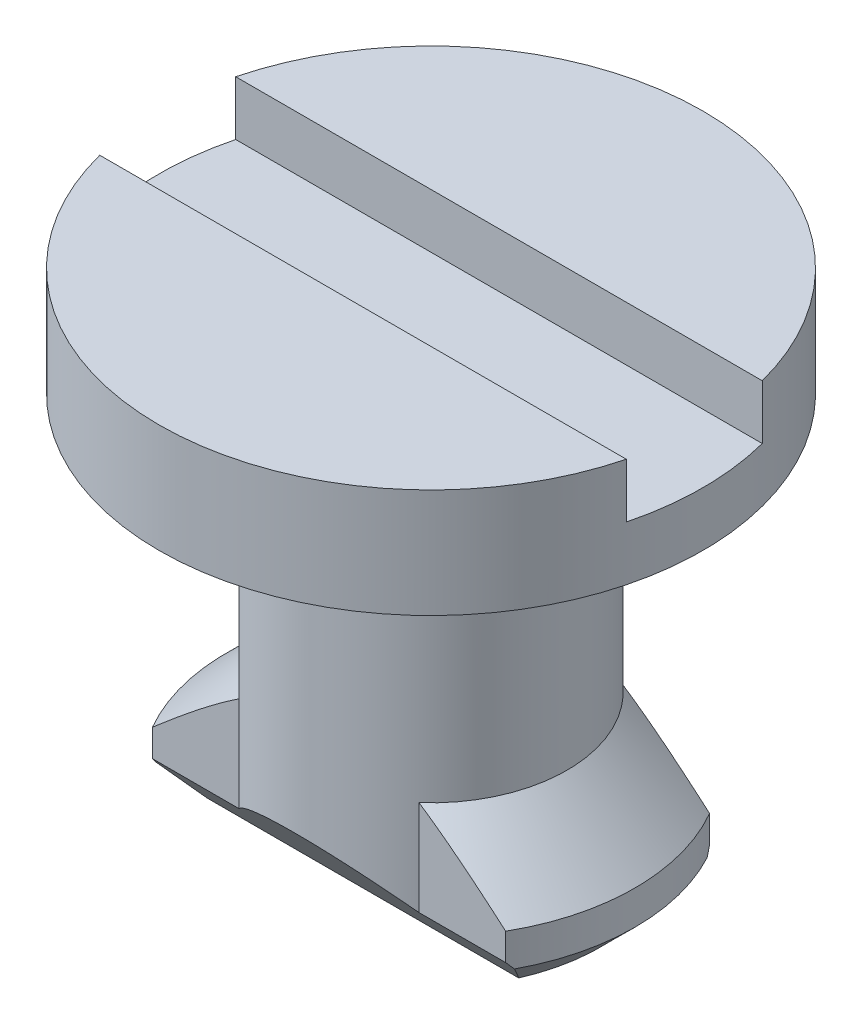
ISO-10303-21;
HEADER;
FILE_DESCRIPTION(('STEP AP214'),'2;1');
FILE_NAME('part.step','',(''),(''),'','','');
FILE_SCHEMA(('AUTOMOTIVE_DESIGN { 1 0 10303 214 1 1 1 1 }'));
ENDSEC;
DATA;
#1=APPLICATION_CONTEXT('core data for automotive mechanical design processes');
#2=APPLICATION_PROTOCOL_DEFINITION('international standard','automotive_design',2000,#1);
#3=PRODUCT_CONTEXT('',#1,'mechanical');
#4=PRODUCT('Part','Part','',(#3));
#5=PRODUCT_RELATED_PRODUCT_CATEGORY('part','',(#4));
#6=PRODUCT_DEFINITION_FORMATION('','',#4);
#7=PRODUCT_DEFINITION_CONTEXT('part definition',#1,'design');
#8=PRODUCT_DEFINITION('design','',#6,#7);
#9=PRODUCT_DEFINITION_SHAPE('','',#8);
#10=(LENGTH_UNIT() NAMED_UNIT(*) SI_UNIT(.MILLI.,.METRE.));
#11=(NAMED_UNIT(*) PLANE_ANGLE_UNIT() SI_UNIT($,.RADIAN.));
#12=(NAMED_UNIT(*) SI_UNIT($,.STERADIAN.) SOLID_ANGLE_UNIT());
#13=UNCERTAINTY_MEASURE_WITH_UNIT(LENGTH_MEASURE(1.E-05),#10,'distance_accuracy_value','');
#14=(GEOMETRIC_REPRESENTATION_CONTEXT(3) GLOBAL_UNCERTAINTY_ASSIGNED_CONTEXT((#13)) GLOBAL_UNIT_ASSIGNED_CONTEXT((#10,
#11,#12)) REPRESENTATION_CONTEXT('',''));
#15=CARTESIAN_POINT('',(0.,0.,0.));
#16=DIRECTION('',(0.,0.,1.));
#17=DIRECTION('',(1.,0.,0.));
#18=AXIS2_PLACEMENT_3D('',#15,#16,#17);
#19=CARTESIAN_POINT('',(0.,1.,0.));
#20=DIRECTION('',(0.,1.,0.));
#21=DIRECTION('',(0.,0.,1.));
#22=AXIS2_PLACEMENT_3D('',#19,#20,#21);
#23=PLANE('',#22);
#24=DIRECTION('',(-1.,0.,0.));
#25=VECTOR('',#24,1.);
#26=CARTESIAN_POINT('',(4.,1.,-1.));
#27=LINE('',#26,#25);
#28=CARTESIAN_POINT('',(3.87298334620742,1.,-1.));
#29=VERTEX_POINT('',#28);
#30=CARTESIAN_POINT('',(-3.87298334620742,1.,-1.));
#31=VERTEX_POINT('',#30);
#32=EDGE_CURVE('E165',#29,#31,#27,.T.);
#33=ORIENTED_EDGE('',*,*,#32,.F.);
#34=CARTESIAN_POINT('',(0.,1.,0.));
#35=DIRECTION('',(0.,1.,0.));
#36=DIRECTION('',(0.,0.,1.));
#37=AXIS2_PLACEMENT_3D('',#34,#35,#36);
#38=CIRCLE('',#37,4.);
#39=EDGE_CURVE('E171',#29,#31,#38,.T.);
#40=ORIENTED_EDGE('',*,*,#39,.T.);
#41=EDGE_LOOP('',(#33,#40));
#42=FACE_BOUND('',#41,.T.);
#43=ADVANCED_FACE('F34',(#42),#23,.T.);
#44=CARTESIAN_POINT('',(0.,-6.4,0.));
#45=DIRECTION('',(0.,1.,0.));
#46=DIRECTION('',(0.,0.,1.));
#47=AXIS2_PLACEMENT_3D('',#44,#45,#46);
#48=CYLINDRICAL_SURFACE('',#47,2.);
#49=CARTESIAN_POINT('',(0.,-0.6,0.));
#50=DIRECTION('',(0.,-1.,0.));
#51=DIRECTION('',(0.,0.,-1.));
#52=AXIS2_PLACEMENT_3D('',#49,#50,#51);
#53=CIRCLE('',#52,2.);
#54=CARTESIAN_POINT('',(0.,-0.6,-2.));
#55=VERTEX_POINT('',#54);
#56=EDGE_CURVE('E265',#55,#55,#53,.T.);
#57=ORIENTED_EDGE('',*,*,#56,.T.);
#58=EDGE_LOOP('',(#57));
#59=FACE_BOUND('',#58,.T.);
#60=CARTESIAN_POINT('',(0.,-7.6,0.));
#61=DIRECTION('',(0.,-0.640184399664479,-0.768221279597376));
#62=DIRECTION('',(0.,0.768221279597376,-0.640184399664479));
#63=AXIS2_PLACEMENT_3D('',#60,#61,#62);
#64=ELLIPSE('',#63,3.12409987036266,2.);
#65=CARTESIAN_POINT('',(1.32287565553229,-5.8,-1.5));
#66=VERTEX_POINT('',#65);
#67=CARTESIAN_POINT('',(-1.32287565553229,-5.8,-1.5));
#68=VERTEX_POINT('',#67);
#69=EDGE_CURVE('E58',#66,#68,#64,.F.);
#70=ORIENTED_EDGE('',*,*,#69,.T.);
#71=DIRECTION('',(0.,1.,0.));
#72=VECTOR('',#71,1.);
#73=CARTESIAN_POINT('',(-1.32287565553229,-6.4,-1.5));
#74=LINE('',#73,#72);
#75=CARTESIAN_POINT('',(-1.32287565553229,-4.4,-1.5));
#76=VERTEX_POINT('',#75);
#77=EDGE_CURVE('E513',#68,#76,#74,.T.);
#78=ORIENTED_EDGE('',*,*,#77,.T.);
#79=CARTESIAN_POINT('',(0.,-4.4,0.));
#80=DIRECTION('',(0.,-1.,0.));
#81=DIRECTION('',(0.,0.,-1.));
#82=AXIS2_PLACEMENT_3D('',#79,#80,#81);
#83=CIRCLE('',#82,2.);
#84=CARTESIAN_POINT('',(-1.3228756555323,-4.4,1.5));
#85=VERTEX_POINT('',#84);
#86=EDGE_CURVE('E175',#85,#76,#83,.T.);
#87=ORIENTED_EDGE('',*,*,#86,.F.);
#88=DIRECTION('',(0.,1.,0.));
#89=VECTOR('',#88,1.);
#90=CARTESIAN_POINT('',(-1.3228756555323,-6.4,1.5));
#91=LINE('',#90,#89);
#92=CARTESIAN_POINT('',(-1.3228756555323,-5.8,1.5));
#93=VERTEX_POINT('',#92);
#94=EDGE_CURVE('E176',#85,#93,#91,.F.);
#95=ORIENTED_EDGE('',*,*,#94,.T.);
#96=CARTESIAN_POINT('',(0.,-7.6,0.));
#97=DIRECTION('',(0.,-0.640184399664479,0.768221279597376));
#98=DIRECTION('',(0.,0.768221279597376,0.640184399664479));
#99=AXIS2_PLACEMENT_3D('',#96,#97,#98);
#100=ELLIPSE('',#99,3.12409987036266,2.);
#101=CARTESIAN_POINT('',(1.3228756555323,-5.8,1.5));
#102=VERTEX_POINT('',#101);
#103=EDGE_CURVE('E491',#93,#102,#100,.F.);
#104=ORIENTED_EDGE('',*,*,#103,.T.);
#105=DIRECTION('',(0.,1.,0.));
#106=VECTOR('',#105,1.);
#107=CARTESIAN_POINT('',(1.3228756555323,-6.4,1.5));
#108=LINE('',#107,#106);
#109=CARTESIAN_POINT('',(1.3228756555323,-4.4,1.5));
#110=VERTEX_POINT('',#109);
#111=EDGE_CURVE('E172',#102,#110,#108,.T.);
#112=ORIENTED_EDGE('',*,*,#111,.T.);
#113=CARTESIAN_POINT('',(1.32287565553229,-4.4,-1.5));
#114=VERTEX_POINT('',#113);
#115=EDGE_CURVE('E182',#114,#110,#83,.T.);
#116=ORIENTED_EDGE('',*,*,#115,.F.);
#117=DIRECTION('',(0.,1.,0.));
#118=VECTOR('',#117,1.);
#119=CARTESIAN_POINT('',(1.32287565553229,-6.4,-1.5));
#120=LINE('',#119,#118);
#121=EDGE_CURVE('E502',#114,#66,#120,.F.);
#122=ORIENTED_EDGE('',*,*,#121,.T.);
#123=EDGE_LOOP('',(#70,#78,#87,#95,#104,#112,#116,#122));
#124=FACE_BOUND('',#123,.T.);
#125=ADVANCED_FACE('F236',(#59,#124),#48,.T.);
#126=CARTESIAN_POINT('',(0.,-6.4,0.));
#127=DIRECTION('',(0.,-1.,0.));
#128=DIRECTION('',(0.,0.,-1.));
#129=AXIS2_PLACEMENT_3D('',#126,#127,#128);
#130=PLANE('',#129);
#131=CARTESIAN_POINT('',(0.,-6.4,0.));
#132=DIRECTION('',(0.,-1.,0.));
#133=DIRECTION('',(0.,0.,-1.));
#134=AXIS2_PLACEMENT_3D('',#131,#132,#133);
#135=CIRCLE('',#134,2.5);
#136=CARTESIAN_POINT('',(-2.29128784747792,-6.4,1.));
#137=VERTEX_POINT('',#136);
#138=CARTESIAN_POINT('',(-2.29128784747792,-6.4,-1.));
#139=VERTEX_POINT('',#138);
#140=EDGE_CURVE('E183',#137,#139,#135,.T.);
#141=ORIENTED_EDGE('',*,*,#140,.T.);
#142=DIRECTION('',(-1.,0.,0.));
#143=VECTOR('',#142,1.);
#144=CARTESIAN_POINT('',(4.001,-6.4,-1.));
#145=LINE('',#144,#143);
#146=CARTESIAN_POINT('',(2.29128784747792,-6.4,-1.));
#147=VERTEX_POINT('',#146);
#148=EDGE_CURVE('E467',#147,#139,#145,.T.);
#149=ORIENTED_EDGE('',*,*,#148,.F.);
#150=CARTESIAN_POINT('',(0.,-6.4,0.));
#151=DIRECTION('',(0.,-1.,0.));
#152=DIRECTION('',(0.,0.,-1.));
#153=AXIS2_PLACEMENT_3D('',#150,#151,#152);
#154=CIRCLE('',#153,2.5);
#155=CARTESIAN_POINT('',(2.29128784747792,-6.4,1.));
#156=VERTEX_POINT('',#155);
#157=EDGE_CURVE('E186',#147,#156,#154,.T.);
#158=ORIENTED_EDGE('',*,*,#157,.T.);
#159=DIRECTION('',(-1.,0.,0.));
#160=VECTOR('',#159,1.);
#161=CARTESIAN_POINT('',(4.001,-6.4,1.));
#162=LINE('',#161,#160);
#163=EDGE_CURVE('E493',#156,#137,#162,.T.);
#164=ORIENTED_EDGE('',*,*,#163,.T.);
#165=EDGE_LOOP('',(#141,#149,#158,#164));
#166=FACE_BOUND('',#165,.T.);
#167=ADVANCED_FACE('F239',(#166),#130,.T.);
#168=CARTESIAN_POINT('',(0.,-4.4,0.));
#169=DIRECTION('',(0.,-1.,0.));
#170=DIRECTION('',(0.,0.,-1.));
#171=AXIS2_PLACEMENT_3D('',#168,#169,#170);
#172=CYLINDRICAL_SURFACE('',#171,3.);
#173=DIRECTION('',(0.,-1.,0.));
#174=VECTOR('',#173,1.);
#175=CARTESIAN_POINT('',(-2.59807621135331,-4.4,-1.5));
#176=LINE('',#175,#174);
#177=CARTESIAN_POINT('',(-2.59807621135331,-5.4,-1.5));
#178=VERTEX_POINT('',#177);
#179=CARTESIAN_POINT('',(-2.59807621135331,-5.8,-1.5));
#180=VERTEX_POINT('',#179);
#181=EDGE_CURVE('E498',#178,#180,#176,.T.);
#182=ORIENTED_EDGE('',*,*,#181,.T.);
#183=CARTESIAN_POINT('',(0.,-7.6,0.));
#184=DIRECTION('',(0.,0.640184399664479,0.768221279597376));
#185=DIRECTION('',(0.,-0.768221279597376,0.640184399664479));
#186=AXIS2_PLACEMENT_3D('',#183,#184,#185);
#187=ELLIPSE('',#186,4.68614980554399,3.);
#188=CARTESIAN_POINT('',(-2.6444386087704,-5.9,-1.41666666666667));
#189=VERTEX_POINT('',#188);
#190=EDGE_CURVE('E289',#180,#189,#187,.T.);
#191=ORIENTED_EDGE('',*,*,#190,.T.);
#192=CARTESIAN_POINT('',(0.,-5.9,0.));
#193=DIRECTION('',(0.,-1.,0.));
#194=DIRECTION('',(0.,0.,-1.));
#195=AXIS2_PLACEMENT_3D('',#192,#193,#194);
#196=CIRCLE('',#195,3.);
#197=CARTESIAN_POINT('',(-2.6444386087704,-5.9,1.41666666666667));
#198=VERTEX_POINT('',#197);
#199=EDGE_CURVE('E191',#189,#198,#196,.F.);
#200=ORIENTED_EDGE('',*,*,#199,.T.);
#201=CARTESIAN_POINT('',(0.,-7.6,0.));
#202=DIRECTION('',(0.,0.640184399664479,-0.768221279597376));
#203=DIRECTION('',(0.,-0.768221279597376,-0.640184399664479));
#204=AXIS2_PLACEMENT_3D('',#201,#202,#203);
#205=ELLIPSE('',#204,4.68614980554399,3.);
#206=CARTESIAN_POINT('',(-2.59807621135332,-5.8,1.5));
#207=VERTEX_POINT('',#206);
#208=EDGE_CURVE('E524',#198,#207,#205,.T.);
#209=ORIENTED_EDGE('',*,*,#208,.T.);
#210=DIRECTION('',(0.,-1.,0.));
#211=VECTOR('',#210,1.);
#212=CARTESIAN_POINT('',(-2.59807621135332,-4.4,1.5));
#213=LINE('',#212,#211);
#214=CARTESIAN_POINT('',(-2.59807621135332,-5.4,1.5));
#215=VERTEX_POINT('',#214);
#216=EDGE_CURVE('E499',#215,#207,#213,.T.);
#217=ORIENTED_EDGE('',*,*,#216,.F.);
#218=CARTESIAN_POINT('',(0.,-5.4,0.));
#219=DIRECTION('',(0.,-1.,0.));
#220=DIRECTION('',(0.,0.,-1.));
#221=AXIS2_PLACEMENT_3D('',#218,#219,#220);
#222=CIRCLE('',#221,3.);
#223=EDGE_CURVE('E260',#215,#178,#222,.T.);
#224=ORIENTED_EDGE('',*,*,#223,.T.);
#225=EDGE_LOOP('',(#182,#191,#200,#209,#217,#224));
#226=FACE_BOUND('',#225,.T.);
#227=ADVANCED_FACE('F243',(#226),#172,.T.);
#228=CARTESIAN_POINT('',(0.,-4.4,0.));
#229=DIRECTION('',(0.,-1.,0.));
#230=DIRECTION('',(0.,0.,-1.));
#231=AXIS2_PLACEMENT_3D('',#228,#229,#230);
#232=CYLINDRICAL_SURFACE('',#231,3.);
#233=CARTESIAN_POINT('',(0.,-5.9,0.));
#234=DIRECTION('',(0.,-1.,0.));
#235=DIRECTION('',(0.,0.,-1.));
#236=AXIS2_PLACEMENT_3D('',#233,#234,#235);
#237=CIRCLE('',#236,3.);
#238=CARTESIAN_POINT('',(2.6444386087704,-5.9,1.41666666666667));
#239=VERTEX_POINT('',#238);
#240=CARTESIAN_POINT('',(2.6444386087704,-5.9,-1.41666666666667));
#241=VERTEX_POINT('',#240);
#242=EDGE_CURVE('E188',#239,#241,#237,.F.);
#243=ORIENTED_EDGE('',*,*,#242,.T.);
#244=CARTESIAN_POINT('',(0.,-7.6,0.));
#245=DIRECTION('',(0.,-0.640184399664479,-0.768221279597376));
#246=DIRECTION('',(0.,-0.768221279597376,0.640184399664479));
#247=AXIS2_PLACEMENT_3D('',#244,#245,#246);
#248=ELLIPSE('',#247,4.68614980554399,3.);
#249=CARTESIAN_POINT('',(2.59807621135332,-5.8,-1.5));
#250=VERTEX_POINT('',#249);
#251=EDGE_CURVE('E469',#250,#241,#248,.T.);
#252=ORIENTED_EDGE('',*,*,#251,.F.);
#253=DIRECTION('',(0.,-1.,0.));
#254=VECTOR('',#253,1.);
#255=CARTESIAN_POINT('',(2.59807621135332,-4.4,-1.5));
#256=LINE('',#255,#254);
#257=CARTESIAN_POINT('',(2.59807621135332,-5.4,-1.5));
#258=VERTEX_POINT('',#257);
#259=EDGE_CURVE('E506',#258,#250,#256,.T.);
#260=ORIENTED_EDGE('',*,*,#259,.F.);
#261=CARTESIAN_POINT('',(0.,-5.4,0.));
#262=DIRECTION('',(0.,-1.,0.));
#263=DIRECTION('',(0.,0.,-1.));
#264=AXIS2_PLACEMENT_3D('',#261,#262,#263);
#265=CIRCLE('',#264,3.);
#266=CARTESIAN_POINT('',(2.59807621135331,-5.4,1.5));
#267=VERTEX_POINT('',#266);
#268=EDGE_CURVE('E193',#258,#267,#265,.T.);
#269=ORIENTED_EDGE('',*,*,#268,.T.);
#270=DIRECTION('',(0.,-1.,0.));
#271=VECTOR('',#270,1.);
#272=CARTESIAN_POINT('',(2.59807621135331,-4.4,1.5));
#273=LINE('',#272,#271);
#274=CARTESIAN_POINT('',(2.59807621135331,-5.8,1.5));
#275=VERTEX_POINT('',#274);
#276=EDGE_CURVE('E503',#267,#275,#273,.T.);
#277=ORIENTED_EDGE('',*,*,#276,.T.);
#278=CARTESIAN_POINT('',(0.,-7.6,0.));
#279=DIRECTION('',(0.,-0.640184399664479,0.768221279597376));
#280=DIRECTION('',(0.,-0.768221279597376,-0.640184399664479));
#281=AXIS2_PLACEMENT_3D('',#278,#279,#280);
#282=ELLIPSE('',#281,4.68614980554399,3.);
#283=EDGE_CURVE('E496',#239,#275,#282,.T.);
#284=ORIENTED_EDGE('',*,*,#283,.F.);
#285=EDGE_LOOP('',(#243,#252,#260,#269,#277,#284));
#286=FACE_BOUND('',#285,.T.);
#287=ADVANCED_FACE('F228',(#286),#232,.T.);
#288=CARTESIAN_POINT('',(0.,-6.4,0.));
#289=DIRECTION('',(0.,1.,0.));
#290=DIRECTION('',(0.,0.,1.));
#291=AXIS2_PLACEMENT_3D('',#288,#289,#290);
#292=CONICAL_SURFACE('',#291,2.5,0.785398163397445);
#293=ORIENTED_EDGE('',*,*,#157,.F.);
#294=CARTESIAN_POINT('',(2.64457621284688,-5.8998,-1.41683333333333));
#295=CARTESIAN_POINT('',(2.61571622950897,-5.94174573392667,-1.38187855506111));
#296=CARTESIAN_POINT('',(2.58672640656105,-5.98363888665853,-1.34696759445122));
#297=CARTESIAN_POINT('',(2.52846110996167,-6.06730594817642,-1.27724504318632));
#298=CARTESIAN_POINT('',(2.49918564601116,-6.10907986095022,-1.24243344920815));
#299=CARTESIAN_POINT('',(2.44032091626879,-6.19249752762652,-1.1729187269779));
#300=CARTESIAN_POINT('',(2.41073164802869,-6.23414128051025,-1.13821559957479));
#301=CARTESIAN_POINT('',(2.35120561961058,-6.31728375835709,-1.06893020136909));
#302=CARTESIAN_POINT('',(2.32126884769734,-6.35878247836048,-1.0343479346996));
#303=CARTESIAN_POINT('',(2.29114236693468,-6.40020000000059,-0.999833333332844));
#304=B_SPLINE_CURVE_WITH_KNOTS('',3,(#294,#295,#296,#297,#298,#299,#300,#301,#302,#303),
.UNSPECIFIED.,.F.,.F.,(4,2,2,2,4),(0.,0.185277194335566,0.370548118041204,0.555820488266647,
0.741099133467552),.UNSPECIFIED.);
#305=EDGE_CURVE('E459',#241,#147,#304,.T.);
#306=ORIENTED_EDGE('',*,*,#305,.F.);
#307=ORIENTED_EDGE('',*,*,#242,.F.);
#308=CARTESIAN_POINT('',(2.29114236693309,-6.40019999999994,0.999833333333381));
#309=CARTESIAN_POINT('',(2.32126884769675,-6.35878247836026,1.03434793469978));
#310=CARTESIAN_POINT('',(2.35120561961041,-6.31728375835704,1.06893020136913));
#311=CARTESIAN_POINT('',(2.41073164802883,-6.23414128051033,1.13821559957473));
#312=CARTESIAN_POINT('',(2.44032091626883,-6.19249752762655,1.17291872697788));
#313=CARTESIAN_POINT('',(2.49918564601111,-6.1090798609502,1.24243344920816));
#314=CARTESIAN_POINT('',(2.52846110996164,-6.06730594817641,1.27724504318632));
#315=CARTESIAN_POINT('',(2.58672640656106,-5.98363888665854,1.34696759445121));
#316=CARTESIAN_POINT('',(2.61571622950901,-5.94174573392669,1.38187855506109));
#317=CARTESIAN_POINT('',(2.64457621284688,-5.8998,1.41683333333333));
#318=B_SPLINE_CURVE_WITH_KNOTS('',3,(#308,#309,#310,#311,#312,#313,#314,#315,#316,#317),
.UNSPECIFIED.,.F.,.F.,(4,2,2,2,4),(0.,0.185278645200922,0.370551015426374,0.555821939132014,
0.741099133467587),.UNSPECIFIED.);
#319=EDGE_CURVE('E484',#156,#239,#318,.T.);
#320=ORIENTED_EDGE('',*,*,#319,.F.);
#321=EDGE_LOOP('',(#293,#306,#307,#320));
#322=FACE_BOUND('',#321,.T.);
#323=ADVANCED_FACE('F224',(#322),#292,.T.);
#324=CARTESIAN_POINT('',(0.,-6.4,0.));
#325=DIRECTION('',(0.,1.,0.));
#326=DIRECTION('',(0.,0.,1.));
#327=AXIS2_PLACEMENT_3D('',#324,#325,#326);
#328=CONICAL_SURFACE('',#327,2.5,0.785398163397445);
#329=ORIENTED_EDGE('',*,*,#199,.F.);
#330=CARTESIAN_POINT('',(-2.64457621284688,-5.8998,-1.41683333333333));
#331=CARTESIAN_POINT('',(-2.61571622950897,-5.94174573392667,-1.38187855506111));
#332=CARTESIAN_POINT('',(-2.58672640656104,-5.98363888665854,-1.34696759445122));
#333=CARTESIAN_POINT('',(-2.52846110996166,-6.06730594817644,-1.2772450431863));
#334=CARTESIAN_POINT('',(-2.49918564601114,-6.10907986095024,-1.24243344920813));
#335=CARTESIAN_POINT('',(-2.44032091626877,-6.19249752762655,-1.17291872697787));
#336=CARTESIAN_POINT('',(-2.41073164802866,-6.23414128051029,-1.13821559957476));
#337=CARTESIAN_POINT('',(-2.35120561961054,-6.31728375835713,-1.06893020136905));
#338=CARTESIAN_POINT('',(-2.3212688476973,-6.35878247836053,-1.03434793469956));
#339=CARTESIAN_POINT('',(-2.29114236693463,-6.40020000000064,-0.999833333332797));
#340=B_SPLINE_CURVE_WITH_KNOTS('',3,(#330,#331,#332,#333,#334,#335,#336,#337,#338,#339),
.UNSPECIFIED.,.F.,.F.,(4,2,2,2,4),(0.,0.185277194335587,0.370548118041246,0.55582048826671,
0.741099133467637),.UNSPECIFIED.);
#341=EDGE_CURVE('E268',#189,#139,#340,.T.);
#342=ORIENTED_EDGE('',*,*,#341,.T.);
#343=ORIENTED_EDGE('',*,*,#140,.F.);
#344=CARTESIAN_POINT('',(-2.29114236693305,-6.4002,0.999833333333334));
#345=CARTESIAN_POINT('',(-2.32126884769672,-6.35878247836031,1.03434793469974));
#346=CARTESIAN_POINT('',(-2.35120561961038,-6.31728375835709,1.06893020136909));
#347=CARTESIAN_POINT('',(-2.41073164802881,-6.23414128051037,1.13821559957469));
#348=CARTESIAN_POINT('',(-2.44032091626881,-6.19249752762658,1.17291872697785));
#349=CARTESIAN_POINT('',(-2.49918564601109,-6.10907986095023,1.24243344920814));
#350=CARTESIAN_POINT('',(-2.52846110996163,-6.06730594817643,1.27724504318631));
#351=CARTESIAN_POINT('',(-2.58672640656106,-5.98363888665855,1.34696759445121));
#352=CARTESIAN_POINT('',(-2.61571622950901,-5.94174573392669,1.38187855506109));
#353=CARTESIAN_POINT('',(-2.64457621284688,-5.8998,1.41683333333333));
#354=B_SPLINE_CURVE_WITH_KNOTS('',3,(#344,#345,#346,#347,#348,#349,#350,#351,#352,#353),
.UNSPECIFIED.,.F.,.F.,(4,2,2,2,4),(0.,0.185278645200943,0.370551015426417,0.555821939132078,
0.741099133467673),.UNSPECIFIED.);
#355=EDGE_CURVE('E471',#137,#198,#354,.T.);
#356=ORIENTED_EDGE('',*,*,#355,.T.);
#357=EDGE_LOOP('',(#329,#342,#343,#356));
#358=FACE_BOUND('',#357,.T.);
#359=ADVANCED_FACE('F219',(#358),#328,.T.);
#360=CARTESIAN_POINT('',(-2.59807621135331,-4.4,-1.5));
#361=DIRECTION('',(0.,0.,-1.));
#362=DIRECTION('',(-1.,0.,0.));
#363=AXIS2_PLACEMENT_3D('',#360,#361,#362);
#364=PLANE('',#363);
#365=ORIENTED_EDGE('',*,*,#77,.F.);
#366=DIRECTION('',(-1.,0.,0.));
#367=VECTOR('',#366,1.);
#368=CARTESIAN_POINT('',(-4.001,-5.8,-1.5));
#369=LINE('',#368,#367);
#370=EDGE_CURVE('E548',#68,#180,#369,.T.);
#371=ORIENTED_EDGE('',*,*,#370,.T.);
#372=ORIENTED_EDGE('',*,*,#181,.F.);
#373=CARTESIAN_POINT('',(-2.59807621135331,-5.4,-1.5));
#374=CARTESIAN_POINT('',(-2.54699202981894,-5.35576185939409,-1.5));
#375=CARTESIAN_POINT('',(-2.49574934324268,-5.31170762331325,-1.5));
#376=CARTESIAN_POINT('',(-2.39288833200145,-5.22403804046788,-1.5));
#377=CARTESIAN_POINT('',(-2.3412699999935,-5.18042270232268,-1.5));
#378=CARTESIAN_POINT('',(-2.18586566547732,-5.05042711859944,-1.5));
#379=CARTESIAN_POINT('',(-2.081432912337,-4.96481248213767,-1.5));
#380=CARTESIAN_POINT('',(-1.92296734799839,-4.83860460277783,-1.5));
#381=CARTESIAN_POINT('',(-1.86982608787186,-4.79689180204332,-1.5));
#382=CARTESIAN_POINT('',(-1.76283273605452,-4.71439359904855,-1.5));
#383=CARTESIAN_POINT('',(-1.70898069254342,-4.67360813443486,-1.5));
#384=CARTESIAN_POINT('',(-1.60037667643988,-4.59314081533693,-1.5));
#385=CARTESIAN_POINT('',(-1.54562391618775,-4.55346001850828,-1.5));
#386=CARTESIAN_POINT('',(-1.43507460370071,-4.4755544852038,-1.5));
#387=CARTESIAN_POINT('',(-1.37927780634971,-4.43733009722093,-1.5));
#388=CARTESIAN_POINT('',(-1.32287565553229,-4.4,-1.5));
#389=B_SPLINE_CURVE_WITH_KNOTS('',3,(#373,#374,#375,#376,#377,#378,#379,#380,#381,#382,#383,
#384,#385,#386,#387,#388),.UNSPECIFIED.,.F.,.F.,(4,2,2,2,2,2,2,4),(0.,0.202728019806967,
0.405460013167092,0.810536547966819,1.01319983446231,1.21584945347921,1.41868685322817,
1.62157248742179),.UNSPECIFIED.);
#390=EDGE_CURVE('E253',#178,#76,#389,.T.);
#391=ORIENTED_EDGE('',*,*,#390,.T.);
#392=EDGE_LOOP('',(#365,#371,#372,#391));
#393=FACE_BOUND('',#392,.T.);
#394=ADVANCED_FACE('F223',(#393),#364,.T.);
#395=ORIENTED_EDGE('',*,*,#259,.T.);
#396=DIRECTION('',(1.,0.,0.));
#397=VECTOR('',#396,1.);
#398=CARTESIAN_POINT('',(4.001,-5.8,-1.5));
#399=LINE('',#398,#397);
#400=EDGE_CURVE('E465',#66,#250,#399,.T.);
#401=ORIENTED_EDGE('',*,*,#400,.F.);
#402=ORIENTED_EDGE('',*,*,#121,.F.);
#403=CARTESIAN_POINT('',(1.32287565553229,-4.4,-1.5));
#404=CARTESIAN_POINT('',(1.37927780634971,-4.43733009722093,-1.5));
#405=CARTESIAN_POINT('',(1.43507460370071,-4.4755544852038,-1.5));
#406=CARTESIAN_POINT('',(1.54562391618775,-4.55346001850828,-1.5));
#407=CARTESIAN_POINT('',(1.60037667643988,-4.59314081533693,-1.5));
#408=CARTESIAN_POINT('',(1.70898069254342,-4.67360813443486,-1.5));
#409=CARTESIAN_POINT('',(1.76283273605452,-4.71439359904855,-1.5));
#410=CARTESIAN_POINT('',(1.86982608787186,-4.79689180204331,-1.5));
#411=CARTESIAN_POINT('',(1.92296734799839,-4.83860460277783,-1.5));
#412=CARTESIAN_POINT('',(2.081432912337,-4.96481248213767,-1.5));
#413=CARTESIAN_POINT('',(2.18586566547732,-5.05042711859944,-1.5));
#414=CARTESIAN_POINT('',(2.3412699999935,-5.18042270232268,-1.5));
#415=CARTESIAN_POINT('',(2.39288833200145,-5.22403804046788,-1.5));
#416=CARTESIAN_POINT('',(2.49574934324268,-5.31170762331325,-1.5));
#417=CARTESIAN_POINT('',(2.54699202981894,-5.35576185939409,-1.5));
#418=CARTESIAN_POINT('',(2.59807621135332,-5.4,-1.5));
#419=B_SPLINE_CURVE_WITH_KNOTS('',3,(#403,#404,#405,#406,#407,#408,#409,#410,#411,#412,#413,
#414,#415,#416,#417,#418),.UNSPECIFIED.,.F.,.F.,(4,2,2,2,2,2,2,4),(0.,0.202885634193624,
0.405723033942588,0.608372652959486,0.811035939454974,1.2161124742547,1.41884446761483,
1.62157248742179),.UNSPECIFIED.);
#420=EDGE_CURVE('E203',#114,#258,#419,.T.);
#421=ORIENTED_EDGE('',*,*,#420,.T.);
#422=EDGE_LOOP('',(#395,#401,#402,#421));
#423=FACE_BOUND('',#422,.T.);
#424=ADVANCED_FACE('F249',(#423),#364,.T.);
#425=CARTESIAN_POINT('',(-2.59807621135332,-4.4,1.5));
#426=DIRECTION('',(0.,0.,1.));
#427=DIRECTION('',(1.,0.,0.));
#428=AXIS2_PLACEMENT_3D('',#425,#426,#427);
#429=PLANE('',#428);
#430=ORIENTED_EDGE('',*,*,#216,.T.);
#431=DIRECTION('',(1.,0.,0.));
#432=VECTOR('',#431,1.);
#433=CARTESIAN_POINT('',(-4.001,-5.8,1.5));
#434=LINE('',#433,#432);
#435=EDGE_CURVE('E477',#207,#93,#434,.T.);
#436=ORIENTED_EDGE('',*,*,#435,.T.);
#437=ORIENTED_EDGE('',*,*,#94,.F.);
#438=CARTESIAN_POINT('',(-1.32287565553229,-4.4,1.5));
#439=CARTESIAN_POINT('',(-1.37927780634971,-4.43733009722093,1.5));
#440=CARTESIAN_POINT('',(-1.43507460370071,-4.4755544852038,1.5));
#441=CARTESIAN_POINT('',(-1.54562391618775,-4.55346001850828,1.5));
#442=CARTESIAN_POINT('',(-1.60037667643988,-4.59314081533693,1.5));
#443=CARTESIAN_POINT('',(-1.70898069254342,-4.67360813443486,1.5));
#444=CARTESIAN_POINT('',(-1.76283273605452,-4.71439359904855,1.5));
#445=CARTESIAN_POINT('',(-1.86982608787186,-4.79689180204332,1.5));
#446=CARTESIAN_POINT('',(-1.92296734799839,-4.83860460277783,1.5));
#447=CARTESIAN_POINT('',(-2.081432912337,-4.96481248213767,1.5));
#448=CARTESIAN_POINT('',(-2.18586566547732,-5.05042711859944,1.5));
#449=CARTESIAN_POINT('',(-2.3412699999935,-5.18042270232268,1.5));
#450=CARTESIAN_POINT('',(-2.39288833200145,-5.22403804046788,1.5));
#451=CARTESIAN_POINT('',(-2.49574934324268,-5.31170762331325,1.5));
#452=CARTESIAN_POINT('',(-2.54699202981894,-5.35576185939409,1.5));
#453=CARTESIAN_POINT('',(-2.59807621135332,-5.4,1.5));
#454=B_SPLINE_CURVE_WITH_KNOTS('',3,(#438,#439,#440,#441,#442,#443,#444,#445,#446,#447,#448,
#449,#450,#451,#452,#453),.UNSPECIFIED.,.F.,.F.,(4,2,2,2,2,2,2,4),(0.,0.202885634193624,
0.405723033942588,0.608372652959486,0.811035939454974,1.2161124742547,1.41884446761483,
1.62157248742179),.UNSPECIFIED.);
#455=EDGE_CURVE('E259',#85,#215,#454,.T.);
#456=ORIENTED_EDGE('',*,*,#455,.T.);
#457=EDGE_LOOP('',(#430,#436,#437,#456));
#458=FACE_BOUND('',#457,.T.);
#459=ADVANCED_FACE('F209',(#458),#429,.T.);
#460=ORIENTED_EDGE('',*,*,#111,.F.);
#461=DIRECTION('',(-1.,0.,0.));
#462=VECTOR('',#461,1.);
#463=CARTESIAN_POINT('',(4.001,-5.8,1.5));
#464=LINE('',#463,#462);
#465=EDGE_CURVE('E490',#275,#102,#464,.T.);
#466=ORIENTED_EDGE('',*,*,#465,.F.);
#467=ORIENTED_EDGE('',*,*,#276,.F.);
#468=CARTESIAN_POINT('',(2.59807621135331,-5.4,1.5));
#469=CARTESIAN_POINT('',(2.54699202981894,-5.35576185939409,1.5));
#470=CARTESIAN_POINT('',(2.49574934324268,-5.31170762331325,1.5));
#471=CARTESIAN_POINT('',(2.39288833200145,-5.22403804046788,1.5));
#472=CARTESIAN_POINT('',(2.3412699999935,-5.18042270232268,1.5));
#473=CARTESIAN_POINT('',(2.18586566547732,-5.05042711859944,1.5));
#474=CARTESIAN_POINT('',(2.081432912337,-4.96481248213767,1.5));
#475=CARTESIAN_POINT('',(1.92296734799839,-4.83860460277783,1.5));
#476=CARTESIAN_POINT('',(1.86982608787186,-4.79689180204331,1.5));
#477=CARTESIAN_POINT('',(1.76283273605452,-4.71439359904855,1.5));
#478=CARTESIAN_POINT('',(1.70898069254342,-4.67360813443486,1.5));
#479=CARTESIAN_POINT('',(1.60037667643988,-4.59314081533693,1.5));
#480=CARTESIAN_POINT('',(1.54562391618775,-4.55346001850828,1.5));
#481=CARTESIAN_POINT('',(1.43507460370071,-4.4755544852038,1.5));
#482=CARTESIAN_POINT('',(1.37927780634971,-4.43733009722093,1.5));
#483=CARTESIAN_POINT('',(1.32287565553229,-4.4,1.5));
#484=B_SPLINE_CURVE_WITH_KNOTS('',3,(#468,#469,#470,#471,#472,#473,#474,#475,#476,#477,#478,
#479,#480,#481,#482,#483),.UNSPECIFIED.,.F.,.F.,(4,2,2,2,2,2,2,4),(0.,0.202728019806966,
0.405460013167091,0.810536547966818,1.01319983446231,1.21584945347921,1.41868685322817,
1.62157248742179),.UNSPECIFIED.);
#485=EDGE_CURVE('E196',#267,#110,#484,.T.);
#486=ORIENTED_EDGE('',*,*,#485,.T.);
#487=EDGE_LOOP('',(#460,#466,#467,#486));
#488=FACE_BOUND('',#487,.T.);
#489=ADVANCED_FACE('F217',(#488),#429,.T.);
#490=CARTESIAN_POINT('',(0.,-5.4,0.));
#491=DIRECTION('',(0.,-1.,0.));
#492=DIRECTION('',(0.,0.,-1.));
#493=AXIS2_PLACEMENT_3D('',#490,#491,#492);
#494=CONICAL_SURFACE('',#493,3.,0.78539816339745);
#495=ORIENTED_EDGE('',*,*,#420,.F.);
#496=ORIENTED_EDGE('',*,*,#115,.T.);
#497=ORIENTED_EDGE('',*,*,#485,.F.);
#498=ORIENTED_EDGE('',*,*,#268,.F.);
#499=EDGE_LOOP('',(#495,#496,#497,#498));
#500=FACE_BOUND('',#499,.T.);
#501=ADVANCED_FACE('F213',(#500),#494,.T.);
#502=CARTESIAN_POINT('',(0.,-5.4,0.));
#503=DIRECTION('',(0.,-1.,0.));
#504=DIRECTION('',(0.,0.,-1.));
#505=AXIS2_PLACEMENT_3D('',#502,#503,#504);
#506=CONICAL_SURFACE('',#505,3.,0.78539816339745);
#507=ORIENTED_EDGE('',*,*,#455,.F.);
#508=ORIENTED_EDGE('',*,*,#86,.T.);
#509=ORIENTED_EDGE('',*,*,#390,.F.);
#510=ORIENTED_EDGE('',*,*,#223,.F.);
#511=EDGE_LOOP('',(#507,#508,#509,#510));
#512=FACE_BOUND('',#511,.T.);
#513=ADVANCED_FACE('F36',(#512),#506,.T.);
#514=CARTESIAN_POINT('',(4.001,-5.2,2.));
#515=DIRECTION('',(0.,-0.640184399664479,0.768221279597376));
#516=DIRECTION('',(0.,-0.768221279597376,-0.640184399664479));
#517=AXIS2_PLACEMENT_3D('',#514,#515,#516);
#518=PLANE('',#517);
#519=ORIENTED_EDGE('',*,*,#163,.F.);
#520=ORIENTED_EDGE('',*,*,#319,.T.);
#521=ORIENTED_EDGE('',*,*,#283,.T.);
#522=ORIENTED_EDGE('',*,*,#465,.T.);
#523=ORIENTED_EDGE('',*,*,#103,.F.);
#524=ORIENTED_EDGE('',*,*,#435,.F.);
#525=ORIENTED_EDGE('',*,*,#208,.F.);
#526=ORIENTED_EDGE('',*,*,#355,.F.);
#527=EDGE_LOOP('',(#519,#520,#521,#522,#523,#524,#525,#526));
#528=FACE_BOUND('',#527,.T.);
#529=ADVANCED_FACE('F372',(#528),#518,.T.);
#530=CARTESIAN_POINT('',(4.001,-5.2,-2.));
#531=DIRECTION('',(0.,-0.640184399664479,-0.768221279597376));
#532=DIRECTION('',(0.,0.768221279597376,-0.640184399664479));
#533=AXIS2_PLACEMENT_3D('',#530,#531,#532);
#534=PLANE('',#533);
#535=ORIENTED_EDGE('',*,*,#400,.T.);
#536=ORIENTED_EDGE('',*,*,#251,.T.);
#537=ORIENTED_EDGE('',*,*,#305,.T.);
#538=ORIENTED_EDGE('',*,*,#148,.T.);
#539=ORIENTED_EDGE('',*,*,#341,.F.);
#540=ORIENTED_EDGE('',*,*,#190,.F.);
#541=ORIENTED_EDGE('',*,*,#370,.F.);
#542=ORIENTED_EDGE('',*,*,#69,.F.);
#543=EDGE_LOOP('',(#535,#536,#537,#538,#539,#540,#541,#542));
#544=FACE_BOUND('',#543,.T.);
#545=ADVANCED_FACE('F297',(#544),#534,.T.);
#546=CARTESIAN_POINT('',(0.,-0.6,0.));
#547=DIRECTION('',(0.,-1.,0.));
#548=DIRECTION('',(0.,0.,-1.));
#549=AXIS2_PLACEMENT_3D('',#546,#547,#548);
#550=PLANE('',#549);
#551=CARTESIAN_POINT('',(0.,-0.6,0.));
#552=DIRECTION('',(0.,-1.,0.));
#553=DIRECTION('',(0.,0.,-1.));
#554=AXIS2_PLACEMENT_3D('',#551,#552,#553);
#555=CIRCLE('',#554,4.);
#556=CARTESIAN_POINT('',(0.,-0.6,-4.));
#557=VERTEX_POINT('',#556);
#558=EDGE_CURVE('E269',#557,#557,#555,.T.);
#559=ORIENTED_EDGE('',*,*,#558,.T.);
#560=EDGE_LOOP('',(#559));
#561=FACE_BOUND('',#560,.T.);
#562=ORIENTED_EDGE('',*,*,#56,.F.);
#563=EDGE_LOOP('',(#562));
#564=FACE_BOUND('',#563,.T.);
#565=ADVANCED_FACE('F235',(#561,#564),#550,.T.);
#566=DIRECTION('',(1.,0.,0.));
#567=VECTOR('',#566,1.);
#568=CARTESIAN_POINT('',(4.,1.,1.));
#569=LINE('',#568,#567);
#570=CARTESIAN_POINT('',(-3.87298334620742,1.,1.));
#571=VERTEX_POINT('',#570);
#572=CARTESIAN_POINT('',(3.87298334620742,1.,1.));
#573=VERTEX_POINT('',#572);
#574=EDGE_CURVE('E151',#571,#573,#569,.T.);
#575=ORIENTED_EDGE('',*,*,#574,.F.);
#576=EDGE_CURVE('E164',#571,#573,#38,.T.);
#577=ORIENTED_EDGE('',*,*,#576,.T.);
#578=EDGE_LOOP('',(#575,#577));
#579=FACE_BOUND('',#578,.T.);
#580=ADVANCED_FACE('F163',(#579),#23,.T.);
#581=CARTESIAN_POINT('',(0.,1.,0.));
#582=DIRECTION('',(0.,-1.,0.));
#583=DIRECTION('',(0.,0.,-1.));
#584=AXIS2_PLACEMENT_3D('',#581,#582,#583);
#585=CYLINDRICAL_SURFACE('',#584,4.);
#586=ORIENTED_EDGE('',*,*,#39,.F.);
#587=DIRECTION('',(0.,-1.,0.));
#588=VECTOR('',#587,1.);
#589=CARTESIAN_POINT('',(3.87298334620742,1.,-1.));
#590=LINE('',#589,#588);
#591=CARTESIAN_POINT('',(3.87298334620742,0.2,-1.));
#592=VERTEX_POINT('',#591);
#593=EDGE_CURVE('E11',#29,#592,#590,.T.);
#594=ORIENTED_EDGE('',*,*,#593,.T.);
#595=CARTESIAN_POINT('',(0.,0.2,0.));
#596=DIRECTION('',(0.,-1.,0.));
#597=DIRECTION('',(0.,0.,-1.));
#598=AXIS2_PLACEMENT_3D('',#595,#596,#597);
#599=CIRCLE('',#598,4.);
#600=CARTESIAN_POINT('',(3.87298334620742,0.2,1.));
#601=VERTEX_POINT('',#600);
#602=EDGE_CURVE('E270',#592,#601,#599,.T.);
#603=ORIENTED_EDGE('',*,*,#602,.T.);
#604=DIRECTION('',(0.,-1.,0.));
#605=VECTOR('',#604,1.);
#606=CARTESIAN_POINT('',(3.87298334620742,1.,1.));
#607=LINE('',#606,#605);
#608=EDGE_CURVE('E43',#601,#573,#607,.F.);
#609=ORIENTED_EDGE('',*,*,#608,.T.);
#610=ORIENTED_EDGE('',*,*,#576,.F.);
#611=DIRECTION('',(0.,-1.,0.));
#612=VECTOR('',#611,1.);
#613=CARTESIAN_POINT('',(-3.87298334620742,1.,1.));
#614=LINE('',#613,#612);
#615=CARTESIAN_POINT('',(-3.87298334620742,0.2,1.));
#616=VERTEX_POINT('',#615);
#617=EDGE_CURVE('E148',#571,#616,#614,.T.);
#618=ORIENTED_EDGE('',*,*,#617,.T.);
#619=CARTESIAN_POINT('',(-3.87298334620742,0.2,-1.));
#620=VERTEX_POINT('',#619);
#621=EDGE_CURVE('E159',#616,#620,#599,.T.);
#622=ORIENTED_EDGE('',*,*,#621,.T.);
#623=DIRECTION('',(0.,-1.,0.));
#624=VECTOR('',#623,1.);
#625=CARTESIAN_POINT('',(-3.87298334620742,1.,-1.));
#626=LINE('',#625,#624);
#627=EDGE_CURVE('E158',#620,#31,#626,.F.);
#628=ORIENTED_EDGE('',*,*,#627,.T.);
#629=EDGE_LOOP('',(#586,#594,#603,#609,#610,#618,#622,#628));
#630=FACE_BOUND('',#629,.T.);
#631=ORIENTED_EDGE('',*,*,#558,.F.);
#632=EDGE_LOOP('',(#631));
#633=FACE_BOUND('',#632,.T.);
#634=ADVANCED_FACE('F168',(#630,#633),#585,.T.);
#635=CARTESIAN_POINT('',(4.,0.2,-1.));
#636=DIRECTION('',(0.,0.,-1.));
#637=DIRECTION('',(-1.,0.,0.));
#638=AXIS2_PLACEMENT_3D('',#635,#636,#637);
#639=PLANE('',#638);
#640=ORIENTED_EDGE('',*,*,#32,.T.);
#641=ORIENTED_EDGE('',*,*,#627,.F.);
#642=DIRECTION('',(-1.,0.,0.));
#643=VECTOR('',#642,1.);
#644=CARTESIAN_POINT('',(4.,0.2,-1.));
#645=LINE('',#644,#643);
#646=EDGE_CURVE('E50',#592,#620,#645,.T.);
#647=ORIENTED_EDGE('',*,*,#646,.F.);
#648=ORIENTED_EDGE('',*,*,#593,.F.);
#649=EDGE_LOOP('',(#640,#641,#647,#648));
#650=FACE_BOUND('',#649,.T.);
#651=ADVANCED_FACE('F232',(#650),#639,.F.);
#652=CARTESIAN_POINT('',(4.,0.2,1.));
#653=DIRECTION('',(0.,0.,1.));
#654=DIRECTION('',(1.,0.,0.));
#655=AXIS2_PLACEMENT_3D('',#652,#653,#654);
#656=PLANE('',#655);
#657=ORIENTED_EDGE('',*,*,#574,.T.);
#658=ORIENTED_EDGE('',*,*,#608,.F.);
#659=DIRECTION('',(1.,0.,0.));
#660=VECTOR('',#659,1.);
#661=CARTESIAN_POINT('',(4.,0.2,1.));
#662=LINE('',#661,#660);
#663=EDGE_CURVE('E154',#616,#601,#662,.T.);
#664=ORIENTED_EDGE('',*,*,#663,.F.);
#665=ORIENTED_EDGE('',*,*,#617,.F.);
#666=EDGE_LOOP('',(#657,#658,#664,#665));
#667=FACE_BOUND('',#666,.T.);
#668=ADVANCED_FACE('F150',(#667),#656,.F.);
#669=CARTESIAN_POINT('',(0.,0.2,0.));
#670=DIRECTION('',(0.,-1.,0.));
#671=DIRECTION('',(0.,0.,-1.));
#672=AXIS2_PLACEMENT_3D('',#669,#670,#671);
#673=PLANE('',#672);
#674=ORIENTED_EDGE('',*,*,#646,.T.);
#675=ORIENTED_EDGE('',*,*,#621,.F.);
#676=ORIENTED_EDGE('',*,*,#663,.T.);
#677=ORIENTED_EDGE('',*,*,#602,.F.);
#678=EDGE_LOOP('',(#674,#675,#676,#677));
#679=FACE_BOUND('',#678,.T.);
#680=ADVANCED_FACE('F273',(#679),#673,.F.);
#681=CLOSED_SHELL('',(#43,#125,#167,#227,#287,#323,#359,#394,#424,#459,#489,#501,#513,#529,#545,
#565,#580,#634,#651,#668,#680));
#682=MANIFOLD_SOLID_BREP('B2',#681);
#683=ADVANCED_BREP_SHAPE_REPRESENTATION('',(#18,#682),#14);
#684=SHAPE_DEFINITION_REPRESENTATION(#9,#683);
ENDSEC;
END-ISO-10303-21;
